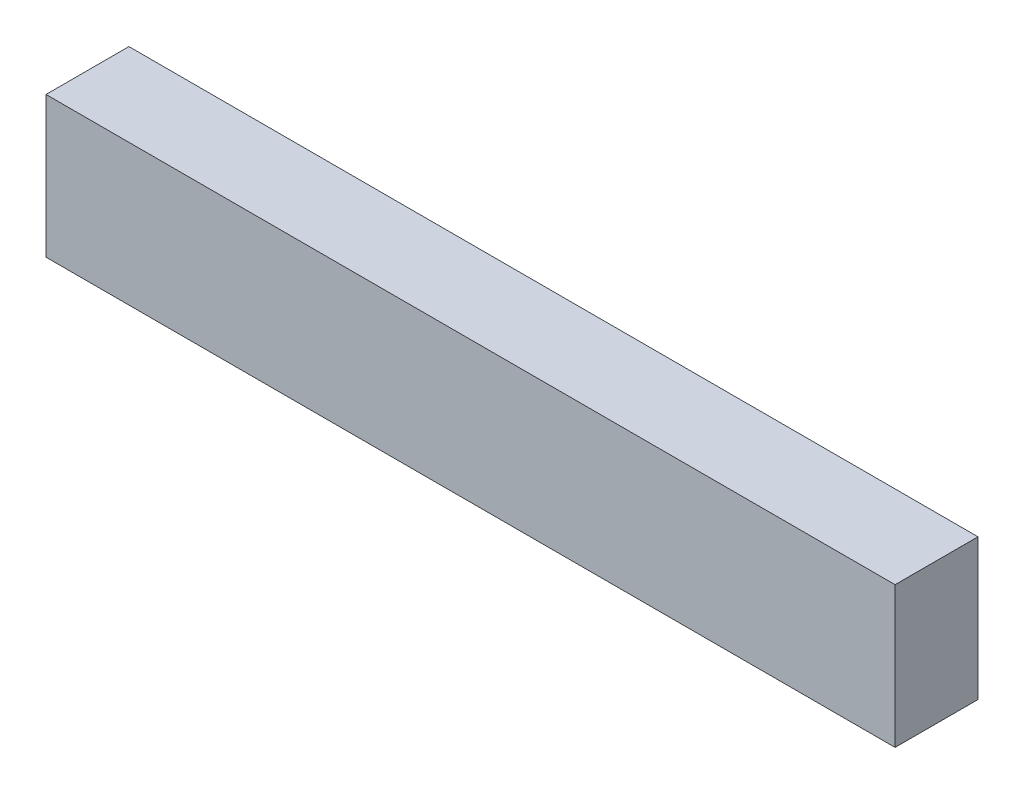
ISO-10303-21;
HEADER;
FILE_DESCRIPTION(('STEP AP214'),'2;1');
FILE_NAME('part.step','',(''),(''),'','','');
FILE_SCHEMA(('AUTOMOTIVE_DESIGN { 1 0 10303 214 1 1 1 1 }'));
ENDSEC;
DATA;
#1=APPLICATION_CONTEXT('core data for automotive mechanical design processes');
#2=APPLICATION_PROTOCOL_DEFINITION('international standard','automotive_design',2000,#1);
#3=PRODUCT_CONTEXT('',#1,'mechanical');
#4=PRODUCT('Part','Part','',(#3));
#5=PRODUCT_RELATED_PRODUCT_CATEGORY('part','',(#4));
#6=PRODUCT_DEFINITION_FORMATION('','',#4);
#7=PRODUCT_DEFINITION_CONTEXT('part definition',#1,'design');
#8=PRODUCT_DEFINITION('design','',#6,#7);
#9=PRODUCT_DEFINITION_SHAPE('','',#8);
#10=(LENGTH_UNIT() NAMED_UNIT(*) SI_UNIT(.MILLI.,.METRE.));
#11=(NAMED_UNIT(*) PLANE_ANGLE_UNIT() SI_UNIT($,.RADIAN.));
#12=(NAMED_UNIT(*) SI_UNIT($,.STERADIAN.) SOLID_ANGLE_UNIT());
#13=UNCERTAINTY_MEASURE_WITH_UNIT(LENGTH_MEASURE(1.E-05),#10,'distance_accuracy_value','');
#14=(GEOMETRIC_REPRESENTATION_CONTEXT(3) GLOBAL_UNCERTAINTY_ASSIGNED_CONTEXT((#13)) GLOBAL_UNIT_ASSIGNED_CONTEXT((#10,
#11,#12)) REPRESENTATION_CONTEXT('',''));
#15=CARTESIAN_POINT('',(0.,0.,0.));
#16=DIRECTION('',(0.,0.,1.));
#17=DIRECTION('',(1.,0.,0.));
#18=AXIS2_PLACEMENT_3D('',#15,#16,#17);
#19=CARTESIAN_POINT('',(25.6,8.5,-2.5));
#20=DIRECTION('',(-1.,0.,0.));
#21=DIRECTION('',(0.,0.,1.));
#22=AXIS2_PLACEMENT_3D('',#19,#20,#21);
#23=PLANE('',#22);
#24=DIRECTION('',(0.,0.,-1.));
#25=VECTOR('',#24,1.);
#26=CARTESIAN_POINT('',(25.6,0.,-2.5));
#27=LINE('',#26,#25);
#28=CARTESIAN_POINT('',(25.6,0.,2.5));
#29=VERTEX_POINT('',#28);
#30=CARTESIAN_POINT('',(25.6,0.,-2.5));
#31=VERTEX_POINT('',#30);
#32=EDGE_CURVE('E96',#29,#31,#27,.T.);
#33=ORIENTED_EDGE('',*,*,#32,.T.);
#34=DIRECTION('',(0.,-1.,0.));
#35=VECTOR('',#34,1.);
#36=CARTESIAN_POINT('',(25.6,8.5,-2.5));
#37=LINE('',#36,#35);
#38=CARTESIAN_POINT('',(25.6,8.5,-2.5));
#39=VERTEX_POINT('',#38);
#40=EDGE_CURVE('E11',#39,#31,#37,.T.);
#41=ORIENTED_EDGE('',*,*,#40,.F.);
#42=DIRECTION('',(0.,0.,-1.));
#43=VECTOR('',#42,1.);
#44=CARTESIAN_POINT('',(25.6,8.5,-2.5));
#45=LINE('',#44,#43);
#46=CARTESIAN_POINT('',(25.6,8.5,2.5));
#47=VERTEX_POINT('',#46);
#48=EDGE_CURVE('E84',#47,#39,#45,.T.);
#49=ORIENTED_EDGE('',*,*,#48,.F.);
#50=DIRECTION('',(0.,-1.,0.));
#51=VECTOR('',#50,1.);
#52=CARTESIAN_POINT('',(25.6,8.5,2.5));
#53=LINE('',#52,#51);
#54=EDGE_CURVE('E92',#47,#29,#53,.T.);
#55=ORIENTED_EDGE('',*,*,#54,.T.);
#56=EDGE_LOOP('',(#33,#41,#49,#55));
#57=FACE_BOUND('',#56,.T.);
#58=ADVANCED_FACE('F33',(#57),#23,.F.);
#59=CARTESIAN_POINT('',(-25.6,8.5,-2.5));
#60=DIRECTION('',(0.,0.,1.));
#61=DIRECTION('',(1.,0.,0.));
#62=AXIS2_PLACEMENT_3D('',#59,#60,#61);
#63=PLANE('',#62);
#64=DIRECTION('',(-1.,0.,0.));
#65=VECTOR('',#64,1.);
#66=CARTESIAN_POINT('',(-25.6,0.,-2.5));
#67=LINE('',#66,#65);
#68=CARTESIAN_POINT('',(-25.6,0.,-2.5));
#69=VERTEX_POINT('',#68);
#70=EDGE_CURVE('E88',#31,#69,#67,.T.);
#71=ORIENTED_EDGE('',*,*,#70,.T.);
#72=DIRECTION('',(0.,-1.,0.));
#73=VECTOR('',#72,1.);
#74=CARTESIAN_POINT('',(-25.6,8.5,-2.5));
#75=LINE('',#74,#73);
#76=CARTESIAN_POINT('',(-25.6,8.5,-2.5));
#77=VERTEX_POINT('',#76);
#78=EDGE_CURVE('E41',#77,#69,#75,.T.);
#79=ORIENTED_EDGE('',*,*,#78,.F.);
#80=DIRECTION('',(-1.,0.,0.));
#81=VECTOR('',#80,1.);
#82=CARTESIAN_POINT('',(-25.6,8.5,-2.5));
#83=LINE('',#82,#81);
#84=EDGE_CURVE('E79',#39,#77,#83,.T.);
#85=ORIENTED_EDGE('',*,*,#84,.F.);
#86=ORIENTED_EDGE('',*,*,#40,.T.);
#87=EDGE_LOOP('',(#71,#79,#85,#86));
#88=FACE_BOUND('',#87,.T.);
#89=ADVANCED_FACE('F87',(#88),#63,.F.);
#90=CARTESIAN_POINT('',(-25.6,8.5,-2.5));
#91=DIRECTION('',(1.,0.,0.));
#92=DIRECTION('',(0.,0.,-1.));
#93=AXIS2_PLACEMENT_3D('',#90,#91,#92);
#94=PLANE('',#93);
#95=DIRECTION('',(0.,0.,1.));
#96=VECTOR('',#95,1.);
#97=CARTESIAN_POINT('',(-25.6,0.,-2.5));
#98=LINE('',#97,#96);
#99=CARTESIAN_POINT('',(-25.6,0.,2.5));
#100=VERTEX_POINT('',#99);
#101=EDGE_CURVE('E66',#69,#100,#98,.T.);
#102=ORIENTED_EDGE('',*,*,#101,.T.);
#103=DIRECTION('',(0.,-1.,0.));
#104=VECTOR('',#103,1.);
#105=CARTESIAN_POINT('',(-25.6,8.5,2.5));
#106=LINE('',#105,#104);
#107=CARTESIAN_POINT('',(-25.6,8.5,2.5));
#108=VERTEX_POINT('',#107);
#109=EDGE_CURVE('E89',#108,#100,#106,.T.);
#110=ORIENTED_EDGE('',*,*,#109,.F.);
#111=DIRECTION('',(0.,0.,1.));
#112=VECTOR('',#111,1.);
#113=CARTESIAN_POINT('',(-25.6,8.5,-2.5));
#114=LINE('',#113,#112);
#115=EDGE_CURVE('E82',#77,#108,#114,.T.);
#116=ORIENTED_EDGE('',*,*,#115,.F.);
#117=ORIENTED_EDGE('',*,*,#78,.T.);
#118=EDGE_LOOP('',(#102,#110,#116,#117));
#119=FACE_BOUND('',#118,.T.);
#120=ADVANCED_FACE('F90',(#119),#94,.F.);
#121=CARTESIAN_POINT('',(-25.6,8.5,2.5));
#122=DIRECTION('',(0.,0.,-1.));
#123=DIRECTION('',(-1.,0.,0.));
#124=AXIS2_PLACEMENT_3D('',#121,#122,#123);
#125=PLANE('',#124);
#126=DIRECTION('',(1.,0.,0.));
#127=VECTOR('',#126,1.);
#128=CARTESIAN_POINT('',(-25.6,0.,2.5));
#129=LINE('',#128,#127);
#130=EDGE_CURVE('E72',#100,#29,#129,.T.);
#131=ORIENTED_EDGE('',*,*,#130,.T.);
#132=ORIENTED_EDGE('',*,*,#54,.F.);
#133=DIRECTION('',(1.,0.,0.));
#134=VECTOR('',#133,1.);
#135=CARTESIAN_POINT('',(-25.6,8.5,2.5));
#136=LINE('',#135,#134);
#137=EDGE_CURVE('E49',#108,#47,#136,.T.);
#138=ORIENTED_EDGE('',*,*,#137,.F.);
#139=ORIENTED_EDGE('',*,*,#109,.T.);
#140=EDGE_LOOP('',(#131,#132,#138,#139));
#141=FACE_BOUND('',#140,.T.);
#142=ADVANCED_FACE('F103',(#141),#125,.F.);
#143=CARTESIAN_POINT('',(0.,8.5,0.));
#144=DIRECTION('',(0.,1.,0.));
#145=DIRECTION('',(0.,0.,1.));
#146=AXIS2_PLACEMENT_3D('',#143,#144,#145);
#147=PLANE('',#146);
#148=ORIENTED_EDGE('',*,*,#48,.T.);
#149=ORIENTED_EDGE('',*,*,#84,.T.);
#150=ORIENTED_EDGE('',*,*,#115,.T.);
#151=ORIENTED_EDGE('',*,*,#137,.T.);
#152=EDGE_LOOP('',(#148,#149,#150,#151));
#153=FACE_BOUND('',#152,.T.);
#154=ADVANCED_FACE('F80',(#153),#147,.T.);
#155=CARTESIAN_POINT('',(0.,0.,0.));
#156=DIRECTION('',(0.,1.,0.));
#157=DIRECTION('',(0.,0.,1.));
#158=AXIS2_PLACEMENT_3D('',#155,#156,#157);
#159=PLANE('',#158);
#160=ORIENTED_EDGE('',*,*,#32,.F.);
#161=ORIENTED_EDGE('',*,*,#130,.F.);
#162=ORIENTED_EDGE('',*,*,#101,.F.);
#163=ORIENTED_EDGE('',*,*,#70,.F.);
#164=EDGE_LOOP('',(#160,#161,#162,#163));
#165=FACE_BOUND('',#164,.T.);
#166=ADVANCED_FACE('F106',(#165),#159,.F.);
#167=CLOSED_SHELL('',(#58,#89,#120,#142,#154,#166));
#168=MANIFOLD_SOLID_BREP('B2',#167);
#169=ADVANCED_BREP_SHAPE_REPRESENTATION('',(#18,#168),#14);
#170=SHAPE_DEFINITION_REPRESENTATION(#9,#169);
ENDSEC;
END-ISO-10303-21;
